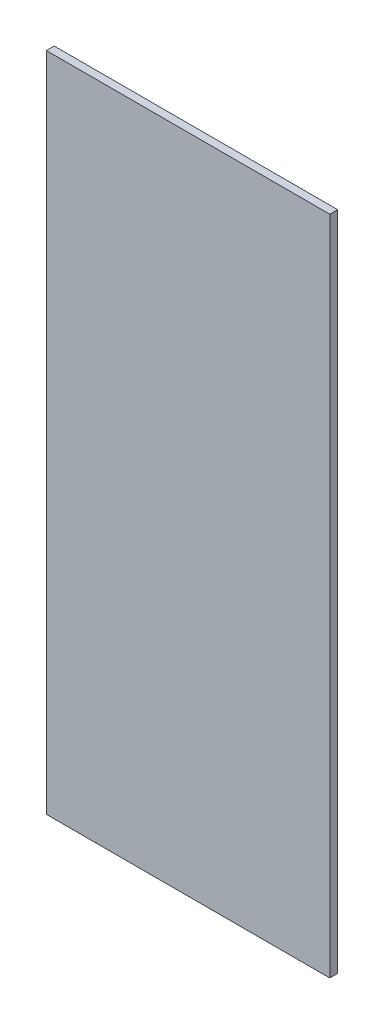
ISO-10303-21;
HEADER;
FILE_DESCRIPTION(('STEP AP214'),'2;1');
FILE_NAME('part.step','',(''),(''),'','','');
FILE_SCHEMA(('AUTOMOTIVE_DESIGN { 1 0 10303 214 1 1 1 1 }'));
ENDSEC;
DATA;
#1=APPLICATION_CONTEXT('core data for automotive mechanical design processes');
#2=APPLICATION_PROTOCOL_DEFINITION('international standard','automotive_design',2000,#1);
#3=PRODUCT_CONTEXT('',#1,'mechanical');
#4=PRODUCT('Part','Part','',(#3));
#5=PRODUCT_RELATED_PRODUCT_CATEGORY('part','',(#4));
#6=PRODUCT_DEFINITION_FORMATION('','',#4);
#7=PRODUCT_DEFINITION_CONTEXT('part definition',#1,'design');
#8=PRODUCT_DEFINITION('design','',#6,#7);
#9=PRODUCT_DEFINITION_SHAPE('','',#8);
#10=(LENGTH_UNIT() NAMED_UNIT(*) SI_UNIT(.MILLI.,.METRE.));
#11=(NAMED_UNIT(*) PLANE_ANGLE_UNIT() SI_UNIT($,.RADIAN.));
#12=(NAMED_UNIT(*) SI_UNIT($,.STERADIAN.) SOLID_ANGLE_UNIT());
#13=UNCERTAINTY_MEASURE_WITH_UNIT(LENGTH_MEASURE(1.E-05),#10,'distance_accuracy_value','');
#14=(GEOMETRIC_REPRESENTATION_CONTEXT(3) GLOBAL_UNCERTAINTY_ASSIGNED_CONTEXT((#13)) GLOBAL_UNIT_ASSIGNED_CONTEXT((#10,
#11,#12)) REPRESENTATION_CONTEXT('',''));
#15=CARTESIAN_POINT('',(0.,0.,0.));
#16=DIRECTION('',(0.,0.,1.));
#17=DIRECTION('',(1.,0.,0.));
#18=AXIS2_PLACEMENT_3D('',#15,#16,#17);
#19=CARTESIAN_POINT('',(90.,210.,5.));
#20=DIRECTION('',(-1.,0.,0.));
#21=DIRECTION('',(0.,-1.,0.));
#22=AXIS2_PLACEMENT_3D('',#19,#20,#21);
#23=PLANE('',#22);
#24=DIRECTION('',(0.,1.,0.));
#25=VECTOR('',#24,1.);
#26=CARTESIAN_POINT('',(90.,210.,0.));
#27=LINE('',#26,#25);
#28=CARTESIAN_POINT('',(90.,-210.,0.));
#29=VERTEX_POINT('',#28);
#30=CARTESIAN_POINT('',(90.,210.,0.));
#31=VERTEX_POINT('',#30);
#32=EDGE_CURVE('E96',#29,#31,#27,.T.);
#33=ORIENTED_EDGE('',*,*,#32,.T.);
#34=DIRECTION('',(0.,0.,-1.));
#35=VECTOR('',#34,1.);
#36=CARTESIAN_POINT('',(90.,210.,5.));
#37=LINE('',#36,#35);
#38=CARTESIAN_POINT('',(90.,210.,5.));
#39=VERTEX_POINT('',#38);
#40=EDGE_CURVE('E11',#39,#31,#37,.T.);
#41=ORIENTED_EDGE('',*,*,#40,.F.);
#42=DIRECTION('',(0.,1.,0.));
#43=VECTOR('',#42,1.);
#44=CARTESIAN_POINT('',(90.,210.,5.));
#45=LINE('',#44,#43);
#46=CARTESIAN_POINT('',(90.,-210.,5.));
#47=VERTEX_POINT('',#46);
#48=EDGE_CURVE('E84',#47,#39,#45,.T.);
#49=ORIENTED_EDGE('',*,*,#48,.F.);
#50=DIRECTION('',(0.,0.,-1.));
#51=VECTOR('',#50,1.);
#52=CARTESIAN_POINT('',(90.,-210.,5.));
#53=LINE('',#52,#51);
#54=EDGE_CURVE('E92',#47,#29,#53,.T.);
#55=ORIENTED_EDGE('',*,*,#54,.T.);
#56=EDGE_LOOP('',(#33,#41,#49,#55));
#57=FACE_BOUND('',#56,.T.);
#58=ADVANCED_FACE('F33',(#57),#23,.F.);
#59=CARTESIAN_POINT('',(-90.,210.,5.));
#60=DIRECTION('',(0.,-1.,0.));
#61=DIRECTION('',(0.,0.,-1.));
#62=AXIS2_PLACEMENT_3D('',#59,#60,#61);
#63=PLANE('',#62);
#64=DIRECTION('',(-1.,0.,0.));
#65=VECTOR('',#64,1.);
#66=CARTESIAN_POINT('',(-90.,210.,0.));
#67=LINE('',#66,#65);
#68=CARTESIAN_POINT('',(-90.,210.,0.));
#69=VERTEX_POINT('',#68);
#70=EDGE_CURVE('E88',#31,#69,#67,.T.);
#71=ORIENTED_EDGE('',*,*,#70,.T.);
#72=DIRECTION('',(0.,0.,-1.));
#73=VECTOR('',#72,1.);
#74=CARTESIAN_POINT('',(-90.,210.,5.));
#75=LINE('',#74,#73);
#76=CARTESIAN_POINT('',(-90.,210.,5.));
#77=VERTEX_POINT('',#76);
#78=EDGE_CURVE('E41',#77,#69,#75,.T.);
#79=ORIENTED_EDGE('',*,*,#78,.F.);
#80=DIRECTION('',(-1.,0.,0.));
#81=VECTOR('',#80,1.);
#82=CARTESIAN_POINT('',(-90.,210.,5.));
#83=LINE('',#82,#81);
#84=EDGE_CURVE('E79',#39,#77,#83,.T.);
#85=ORIENTED_EDGE('',*,*,#84,.F.);
#86=ORIENTED_EDGE('',*,*,#40,.T.);
#87=EDGE_LOOP('',(#71,#79,#85,#86));
#88=FACE_BOUND('',#87,.T.);
#89=ADVANCED_FACE('F87',(#88),#63,.F.);
#90=CARTESIAN_POINT('',(-90.,210.,5.));
#91=DIRECTION('',(1.,0.,0.));
#92=DIRECTION('',(0.,1.,0.));
#93=AXIS2_PLACEMENT_3D('',#90,#91,#92);
#94=PLANE('',#93);
#95=DIRECTION('',(0.,-1.,0.));
#96=VECTOR('',#95,1.);
#97=CARTESIAN_POINT('',(-90.,210.,0.));
#98=LINE('',#97,#96);
#99=CARTESIAN_POINT('',(-90.,-210.,0.));
#100=VERTEX_POINT('',#99);
#101=EDGE_CURVE('E66',#69,#100,#98,.T.);
#102=ORIENTED_EDGE('',*,*,#101,.T.);
#103=DIRECTION('',(0.,0.,-1.));
#104=VECTOR('',#103,1.);
#105=CARTESIAN_POINT('',(-90.,-210.,5.));
#106=LINE('',#105,#104);
#107=CARTESIAN_POINT('',(-90.,-210.,5.));
#108=VERTEX_POINT('',#107);
#109=EDGE_CURVE('E89',#108,#100,#106,.T.);
#110=ORIENTED_EDGE('',*,*,#109,.F.);
#111=DIRECTION('',(0.,-1.,0.));
#112=VECTOR('',#111,1.);
#113=CARTESIAN_POINT('',(-90.,210.,5.));
#114=LINE('',#113,#112);
#115=EDGE_CURVE('E82',#77,#108,#114,.T.);
#116=ORIENTED_EDGE('',*,*,#115,.F.);
#117=ORIENTED_EDGE('',*,*,#78,.T.);
#118=EDGE_LOOP('',(#102,#110,#116,#117));
#119=FACE_BOUND('',#118,.T.);
#120=ADVANCED_FACE('F90',(#119),#94,.F.);
#121=CARTESIAN_POINT('',(-90.,-210.,5.));
#122=DIRECTION('',(0.,1.,0.));
#123=DIRECTION('',(0.,0.,1.));
#124=AXIS2_PLACEMENT_3D('',#121,#122,#123);
#125=PLANE('',#124);
#126=DIRECTION('',(1.,0.,0.));
#127=VECTOR('',#126,1.);
#128=CARTESIAN_POINT('',(-90.,-210.,0.));
#129=LINE('',#128,#127);
#130=EDGE_CURVE('E72',#100,#29,#129,.T.);
#131=ORIENTED_EDGE('',*,*,#130,.T.);
#132=ORIENTED_EDGE('',*,*,#54,.F.);
#133=DIRECTION('',(1.,0.,0.));
#134=VECTOR('',#133,1.);
#135=CARTESIAN_POINT('',(-90.,-210.,5.));
#136=LINE('',#135,#134);
#137=EDGE_CURVE('E49',#108,#47,#136,.T.);
#138=ORIENTED_EDGE('',*,*,#137,.F.);
#139=ORIENTED_EDGE('',*,*,#109,.T.);
#140=EDGE_LOOP('',(#131,#132,#138,#139));
#141=FACE_BOUND('',#140,.T.);
#142=ADVANCED_FACE('F103',(#141),#125,.F.);
#143=CARTESIAN_POINT('',(0.,0.,5.));
#144=DIRECTION('',(0.,0.,1.));
#145=DIRECTION('',(1.,0.,0.));
#146=AXIS2_PLACEMENT_3D('',#143,#144,#145);
#147=PLANE('',#146);
#148=ORIENTED_EDGE('',*,*,#48,.T.);
#149=ORIENTED_EDGE('',*,*,#84,.T.);
#150=ORIENTED_EDGE('',*,*,#115,.T.);
#151=ORIENTED_EDGE('',*,*,#137,.T.);
#152=EDGE_LOOP('',(#148,#149,#150,#151));
#153=FACE_BOUND('',#152,.T.);
#154=ADVANCED_FACE('F80',(#153),#147,.T.);
#155=CARTESIAN_POINT('',(0.,0.,0.));
#156=DIRECTION('',(0.,0.,1.));
#157=DIRECTION('',(1.,0.,0.));
#158=AXIS2_PLACEMENT_3D('',#155,#156,#157);
#159=PLANE('',#158);
#160=ORIENTED_EDGE('',*,*,#32,.F.);
#161=ORIENTED_EDGE('',*,*,#130,.F.);
#162=ORIENTED_EDGE('',*,*,#101,.F.);
#163=ORIENTED_EDGE('',*,*,#70,.F.);
#164=EDGE_LOOP('',(#160,#161,#162,#163));
#165=FACE_BOUND('',#164,.T.);
#166=ADVANCED_FACE('F106',(#165),#159,.F.);
#167=CLOSED_SHELL('',(#58,#89,#120,#142,#154,#166));
#168=MANIFOLD_SOLID_BREP('B2',#167);
#169=ADVANCED_BREP_SHAPE_REPRESENTATION('',(#18,#168),#14);
#170=SHAPE_DEFINITION_REPRESENTATION(#9,#169);
ENDSEC;
END-ISO-10303-21;
